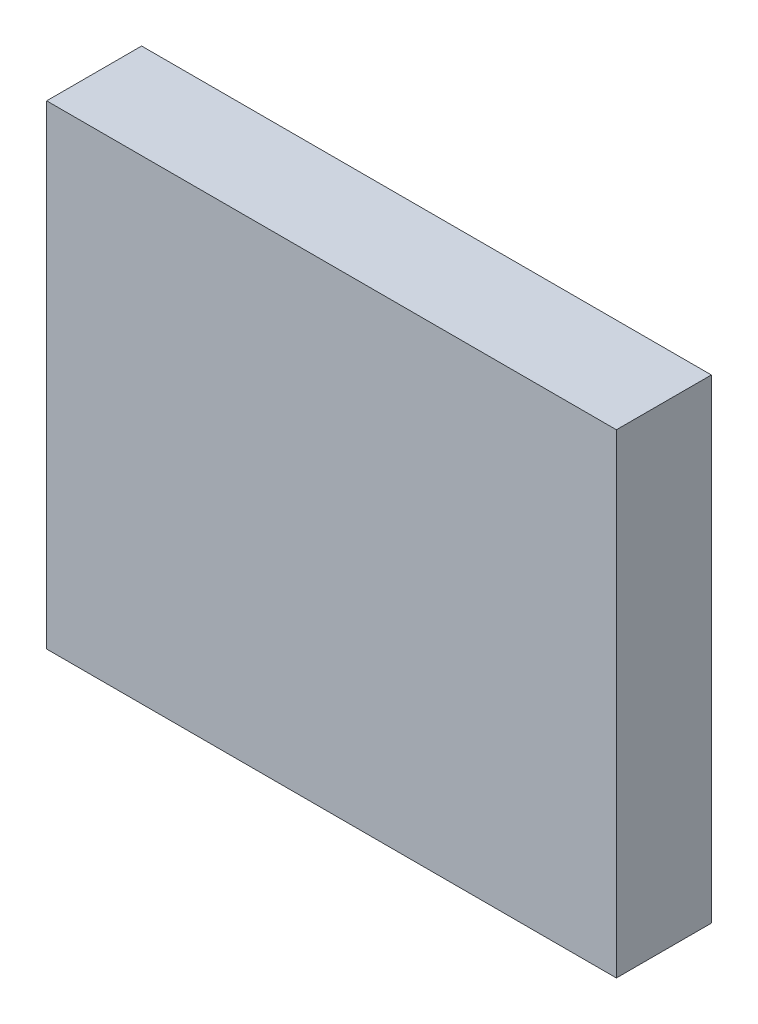
ISO-10303-21;
HEADER;
FILE_DESCRIPTION(('STEP AP214'),'2;1');
FILE_NAME('part.step','',(''),(''),'','','');
FILE_SCHEMA(('AUTOMOTIVE_DESIGN { 1 0 10303 214 1 1 1 1 }'));
ENDSEC;
DATA;
#1=APPLICATION_CONTEXT('core data for automotive mechanical design processes');
#2=APPLICATION_PROTOCOL_DEFINITION('international standard','automotive_design',2000,#1);
#3=PRODUCT_CONTEXT('',#1,'mechanical');
#4=PRODUCT('Part','Part','',(#3));
#5=PRODUCT_RELATED_PRODUCT_CATEGORY('part','',(#4));
#6=PRODUCT_DEFINITION_FORMATION('','',#4);
#7=PRODUCT_DEFINITION_CONTEXT('part definition',#1,'design');
#8=PRODUCT_DEFINITION('design','',#6,#7);
#9=PRODUCT_DEFINITION_SHAPE('','',#8);
#10=(LENGTH_UNIT() NAMED_UNIT(*) SI_UNIT(.MILLI.,.METRE.));
#11=(NAMED_UNIT(*) PLANE_ANGLE_UNIT() SI_UNIT($,.RADIAN.));
#12=(NAMED_UNIT(*) SI_UNIT($,.STERADIAN.) SOLID_ANGLE_UNIT());
#13=UNCERTAINTY_MEASURE_WITH_UNIT(LENGTH_MEASURE(1.E-05),#10,'distance_accuracy_value','');
#14=(GEOMETRIC_REPRESENTATION_CONTEXT(3) GLOBAL_UNCERTAINTY_ASSIGNED_CONTEXT((#13)) GLOBAL_UNIT_ASSIGNED_CONTEXT((#10,
#11,#12)) REPRESENTATION_CONTEXT('',''));
#15=CARTESIAN_POINT('',(0.,0.,0.));
#16=DIRECTION('',(0.,0.,1.));
#17=DIRECTION('',(1.,0.,0.));
#18=AXIS2_PLACEMENT_3D('',#15,#16,#17);
#19=CARTESIAN_POINT('',(0.,0.,0.));
#20=DIRECTION('',(0.,0.,1.));
#21=DIRECTION('',(1.,0.,0.));
#22=AXIS2_PLACEMENT_3D('',#19,#20,#21);
#23=PLANE('',#22);
#24=DIRECTION('',(0.,-1.,0.));
#25=VECTOR('',#24,1.);
#26=CARTESIAN_POINT('',(-60.,50.,0.));
#27=LINE('',#26,#25);
#28=CARTESIAN_POINT('',(-60.,50.,0.));
#29=VERTEX_POINT('',#28);
#30=CARTESIAN_POINT('',(-60.,-50.,0.));
#31=VERTEX_POINT('',#30);
#32=EDGE_CURVE('E153',#29,#31,#27,.T.);
#33=ORIENTED_EDGE('',*,*,#32,.F.);
#34=DIRECTION('',(1.,0.,0.));
#35=VECTOR('',#34,1.);
#36=CARTESIAN_POINT('',(-60.,50.,0.));
#37=LINE('',#36,#35);
#38=CARTESIAN_POINT('',(60.,50.,0.));
#39=VERTEX_POINT('',#38);
#40=EDGE_CURVE('E146',#29,#39,#37,.T.);
#41=ORIENTED_EDGE('',*,*,#40,.T.);
#42=DIRECTION('',(0.,-1.,0.));
#43=VECTOR('',#42,1.);
#44=CARTESIAN_POINT('',(60.,50.,0.));
#45=LINE('',#44,#43);
#46=CARTESIAN_POINT('',(60.,-50.,0.));
#47=VERTEX_POINT('',#46);
#48=EDGE_CURVE('E159',#39,#47,#45,.T.);
#49=ORIENTED_EDGE('',*,*,#48,.T.);
#50=DIRECTION('',(1.,0.,0.));
#51=VECTOR('',#50,1.);
#52=CARTESIAN_POINT('',(-60.,-50.,0.));
#53=LINE('',#52,#51);
#54=EDGE_CURVE('E155',#31,#47,#53,.T.);
#55=ORIENTED_EDGE('',*,*,#54,.F.);
#56=EDGE_LOOP('',(#33,#41,#49,#55));
#57=FACE_BOUND('',#56,.T.);
#58=CARTESIAN_POINT('',(-30.,-30.,0.));
#59=DIRECTION('',(0.,0.,1.));
#60=DIRECTION('',(1.,0.,0.));
#61=AXIS2_PLACEMENT_3D('',#58,#59,#60);
#62=CIRCLE('',#61,8.);
#63=CARTESIAN_POINT('',(-30.,-22.,0.));
#64=VERTEX_POINT('',#63);
#65=CARTESIAN_POINT('',(-30.,-38.,0.));
#66=VERTEX_POINT('',#65);
#67=EDGE_CURVE('E49',#64,#66,#62,.T.);
#68=ORIENTED_EDGE('',*,*,#67,.T.);
#69=DIRECTION('',(1.,0.,0.));
#70=VECTOR('',#69,1.);
#71=CARTESIAN_POINT('',(-30.,-38.,0.));
#72=LINE('',#71,#70);
#73=CARTESIAN_POINT('',(30.,-38.,0.));
#74=VERTEX_POINT('',#73);
#75=EDGE_CURVE('E130',#66,#74,#72,.T.);
#76=ORIENTED_EDGE('',*,*,#75,.T.);
#77=CARTESIAN_POINT('',(30.,-30.,0.));
#78=DIRECTION('',(0.,0.,1.));
#79=DIRECTION('',(1.,0.,0.));
#80=AXIS2_PLACEMENT_3D('',#77,#78,#79);
#81=CIRCLE('',#80,8.);
#82=CARTESIAN_POINT('',(30.,-22.,0.));
#83=VERTEX_POINT('',#82);
#84=EDGE_CURVE('E113',#74,#83,#81,.T.);
#85=ORIENTED_EDGE('',*,*,#84,.T.);
#86=DIRECTION('',(1.,0.,0.));
#87=VECTOR('',#86,1.);
#88=CARTESIAN_POINT('',(-30.,-22.,0.));
#89=LINE('',#88,#87);
#90=EDGE_CURVE('E124',#64,#83,#89,.T.);
#91=ORIENTED_EDGE('',*,*,#90,.F.);
#92=EDGE_LOOP('',(#68,#76,#85,#91));
#93=FACE_BOUND('',#92,.T.);
#94=CARTESIAN_POINT('',(0.,0.,0.));
#95=DIRECTION('',(0.,0.,1.));
#96=DIRECTION('',(1.,0.,0.));
#97=AXIS2_PLACEMENT_3D('',#94,#95,#96);
#98=CIRCLE('',#97,12.5);
#99=CARTESIAN_POINT('',(12.5,0.,0.));
#100=VERTEX_POINT('',#99);
#101=EDGE_CURVE('E136',#100,#100,#98,.T.);
#102=ORIENTED_EDGE('',*,*,#101,.T.);
#103=EDGE_LOOP('',(#102));
#104=FACE_BOUND('',#103,.T.);
#105=ADVANCED_FACE('F34',(#57,#93,#104),#23,.F.);
#106=CARTESIAN_POINT('',(-60.,50.,20.));
#107=DIRECTION('',(1.,0.,0.));
#108=DIRECTION('',(0.,1.,0.));
#109=AXIS2_PLACEMENT_3D('',#106,#107,#108);
#110=PLANE('',#109);
#111=ORIENTED_EDGE('',*,*,#32,.T.);
#112=DIRECTION('',(0.,0.,-1.));
#113=VECTOR('',#112,1.);
#114=CARTESIAN_POINT('',(-60.,-50.,20.));
#115=LINE('',#114,#113);
#116=CARTESIAN_POINT('',(-60.,-50.,20.));
#117=VERTEX_POINT('',#116);
#118=EDGE_CURVE('E11',#117,#31,#115,.T.);
#119=ORIENTED_EDGE('',*,*,#118,.F.);
#120=DIRECTION('',(0.,-1.,0.));
#121=VECTOR('',#120,1.);
#122=CARTESIAN_POINT('',(-60.,50.,20.));
#123=LINE('',#122,#121);
#124=CARTESIAN_POINT('',(-60.,50.,20.));
#125=VERTEX_POINT('',#124);
#126=EDGE_CURVE('E144',#125,#117,#123,.T.);
#127=ORIENTED_EDGE('',*,*,#126,.F.);
#128=DIRECTION('',(0.,0.,-1.));
#129=VECTOR('',#128,1.);
#130=CARTESIAN_POINT('',(-60.,50.,20.));
#131=LINE('',#130,#129);
#132=EDGE_CURVE('E58',#125,#29,#131,.T.);
#133=ORIENTED_EDGE('',*,*,#132,.T.);
#134=EDGE_LOOP('',(#111,#119,#127,#133));
#135=FACE_BOUND('',#134,.T.);
#136=ADVANCED_FACE('F36',(#135),#110,.F.);
#137=CARTESIAN_POINT('',(-60.,-50.,20.));
#138=DIRECTION('',(0.,1.,0.));
#139=DIRECTION('',(0.,0.,1.));
#140=AXIS2_PLACEMENT_3D('',#137,#138,#139);
#141=PLANE('',#140);
#142=ORIENTED_EDGE('',*,*,#54,.T.);
#143=DIRECTION('',(0.,0.,-1.));
#144=VECTOR('',#143,1.);
#145=CARTESIAN_POINT('',(60.,-50.,20.));
#146=LINE('',#145,#144);
#147=CARTESIAN_POINT('',(60.,-50.,20.));
#148=VERTEX_POINT('',#147);
#149=EDGE_CURVE('E42',#148,#47,#146,.T.);
#150=ORIENTED_EDGE('',*,*,#149,.F.);
#151=DIRECTION('',(1.,0.,0.));
#152=VECTOR('',#151,1.);
#153=CARTESIAN_POINT('',(-60.,-50.,20.));
#154=LINE('',#153,#152);
#155=EDGE_CURVE('E84',#117,#148,#154,.T.);
#156=ORIENTED_EDGE('',*,*,#155,.F.);
#157=ORIENTED_EDGE('',*,*,#118,.T.);
#158=EDGE_LOOP('',(#142,#150,#156,#157));
#159=FACE_BOUND('',#158,.T.);
#160=ADVANCED_FACE('F170',(#159),#141,.F.);
#161=CARTESIAN_POINT('',(60.,50.,20.));
#162=DIRECTION('',(1.,0.,0.));
#163=DIRECTION('',(0.,1.,0.));
#164=AXIS2_PLACEMENT_3D('',#161,#162,#163);
#165=PLANE('',#164);
#166=ORIENTED_EDGE('',*,*,#48,.F.);
#167=DIRECTION('',(0.,0.,-1.));
#168=VECTOR('',#167,1.);
#169=CARTESIAN_POINT('',(60.,50.,20.));
#170=LINE('',#169,#168);
#171=CARTESIAN_POINT('',(60.,50.,20.));
#172=VERTEX_POINT('',#171);
#173=EDGE_CURVE('E165',#172,#39,#170,.T.);
#174=ORIENTED_EDGE('',*,*,#173,.F.);
#175=DIRECTION('',(0.,-1.,0.));
#176=VECTOR('',#175,1.);
#177=CARTESIAN_POINT('',(60.,50.,20.));
#178=LINE('',#177,#176);
#179=EDGE_CURVE('E148',#172,#148,#178,.T.);
#180=ORIENTED_EDGE('',*,*,#179,.T.);
#181=ORIENTED_EDGE('',*,*,#149,.T.);
#182=EDGE_LOOP('',(#166,#174,#180,#181));
#183=FACE_BOUND('',#182,.T.);
#184=ADVANCED_FACE('F168',(#183),#165,.T.);
#185=CARTESIAN_POINT('',(-60.,50.,20.));
#186=DIRECTION('',(0.,1.,0.));
#187=DIRECTION('',(0.,0.,1.));
#188=AXIS2_PLACEMENT_3D('',#185,#186,#187);
#189=PLANE('',#188);
#190=ORIENTED_EDGE('',*,*,#40,.F.);
#191=ORIENTED_EDGE('',*,*,#132,.F.);
#192=DIRECTION('',(1.,0.,0.));
#193=VECTOR('',#192,1.);
#194=CARTESIAN_POINT('',(-60.,50.,20.));
#195=LINE('',#194,#193);
#196=EDGE_CURVE('E151',#125,#172,#195,.T.);
#197=ORIENTED_EDGE('',*,*,#196,.T.);
#198=ORIENTED_EDGE('',*,*,#173,.T.);
#199=EDGE_LOOP('',(#190,#191,#197,#198));
#200=FACE_BOUND('',#199,.T.);
#201=ADVANCED_FACE('F173',(#200),#189,.T.);
#202=CARTESIAN_POINT('',(0.,0.,20.));
#203=DIRECTION('',(0.,0.,1.));
#204=DIRECTION('',(1.,0.,0.));
#205=AXIS2_PLACEMENT_3D('',#202,#203,#204);
#206=PLANE('',#205);
#207=ORIENTED_EDGE('',*,*,#126,.T.);
#208=ORIENTED_EDGE('',*,*,#155,.T.);
#209=ORIENTED_EDGE('',*,*,#179,.F.);
#210=ORIENTED_EDGE('',*,*,#196,.F.);
#211=EDGE_LOOP('',(#207,#208,#209,#210));
#212=FACE_BOUND('',#211,.T.);
#213=ADVANCED_FACE('F176',(#212),#206,.T.);
#214=CARTESIAN_POINT('',(-30.,-30.,10.));
#215=DIRECTION('',(0.,0.,-1.));
#216=DIRECTION('',(-1.,0.,0.));
#217=AXIS2_PLACEMENT_3D('',#214,#215,#216);
#218=CYLINDRICAL_SURFACE('',#217,8.);
#219=ORIENTED_EDGE('',*,*,#67,.F.);
#220=DIRECTION('',(0.,0.,-1.));
#221=VECTOR('',#220,1.);
#222=CARTESIAN_POINT('',(-30.,-22.,10.));
#223=LINE('',#222,#221);
#224=CARTESIAN_POINT('',(-30.,-22.,10.));
#225=VERTEX_POINT('',#224);
#226=EDGE_CURVE('E120',#225,#64,#223,.T.);
#227=ORIENTED_EDGE('',*,*,#226,.F.);
#228=CARTESIAN_POINT('',(-30.,-30.,10.));
#229=DIRECTION('',(0.,0.,1.));
#230=DIRECTION('',(1.,0.,0.));
#231=AXIS2_PLACEMENT_3D('',#228,#229,#230);
#232=CIRCLE('',#231,8.);
#233=CARTESIAN_POINT('',(-30.,-38.,10.));
#234=VERTEX_POINT('',#233);
#235=EDGE_CURVE('E127',#225,#234,#232,.T.);
#236=ORIENTED_EDGE('',*,*,#235,.T.);
#237=DIRECTION('',(0.,0.,-1.));
#238=VECTOR('',#237,1.);
#239=CARTESIAN_POINT('',(-30.,-38.,10.));
#240=LINE('',#239,#238);
#241=EDGE_CURVE('E294',#234,#66,#240,.T.);
#242=ORIENTED_EDGE('',*,*,#241,.T.);
#243=EDGE_LOOP('',(#219,#227,#236,#242));
#244=FACE_BOUND('',#243,.T.);
#245=ADVANCED_FACE('F205',(#244),#218,.F.);
#246=CARTESIAN_POINT('',(-30.,-38.,10.));
#247=DIRECTION('',(0.,1.,0.));
#248=DIRECTION('',(-1.,0.,0.));
#249=AXIS2_PLACEMENT_3D('',#246,#247,#248);
#250=PLANE('',#249);
#251=ORIENTED_EDGE('',*,*,#75,.F.);
#252=ORIENTED_EDGE('',*,*,#241,.F.);
#253=DIRECTION('',(1.,0.,0.));
#254=VECTOR('',#253,1.);
#255=CARTESIAN_POINT('',(-30.,-38.,10.));
#256=LINE('',#255,#254);
#257=CARTESIAN_POINT('',(30.,-38.,10.));
#258=VERTEX_POINT('',#257);
#259=EDGE_CURVE('E140',#234,#258,#256,.T.);
#260=ORIENTED_EDGE('',*,*,#259,.T.);
#261=DIRECTION('',(0.,0.,-1.));
#262=VECTOR('',#261,1.);
#263=CARTESIAN_POINT('',(30.,-38.,10.));
#264=LINE('',#263,#262);
#265=EDGE_CURVE('E121',#258,#74,#264,.T.);
#266=ORIENTED_EDGE('',*,*,#265,.T.);
#267=EDGE_LOOP('',(#251,#252,#260,#266));
#268=FACE_BOUND('',#267,.T.);
#269=ADVANCED_FACE('F211',(#268),#250,.T.);
#270=CARTESIAN_POINT('',(30.,-30.,10.));
#271=DIRECTION('',(0.,0.,-1.));
#272=DIRECTION('',(-1.,0.,0.));
#273=AXIS2_PLACEMENT_3D('',#270,#271,#272);
#274=CYLINDRICAL_SURFACE('',#273,8.);
#275=ORIENTED_EDGE('',*,*,#84,.F.);
#276=ORIENTED_EDGE('',*,*,#265,.F.);
#277=CARTESIAN_POINT('',(30.,-30.,10.));
#278=DIRECTION('',(0.,0.,1.));
#279=DIRECTION('',(1.,0.,0.));
#280=AXIS2_PLACEMENT_3D('',#277,#278,#279);
#281=CIRCLE('',#280,8.);
#282=CARTESIAN_POINT('',(30.,-22.,10.));
#283=VERTEX_POINT('',#282);
#284=EDGE_CURVE('E116',#258,#283,#281,.T.);
#285=ORIENTED_EDGE('',*,*,#284,.T.);
#286=DIRECTION('',(0.,0.,-1.));
#287=VECTOR('',#286,1.);
#288=CARTESIAN_POINT('',(30.,-22.,10.));
#289=LINE('',#288,#287);
#290=EDGE_CURVE('E108',#283,#83,#289,.T.);
#291=ORIENTED_EDGE('',*,*,#290,.T.);
#292=EDGE_LOOP('',(#275,#276,#285,#291));
#293=FACE_BOUND('',#292,.T.);
#294=ADVANCED_FACE('F110',(#293),#274,.F.);
#295=CARTESIAN_POINT('',(-30.,-22.,10.));
#296=DIRECTION('',(0.,1.,0.));
#297=DIRECTION('',(-1.,0.,0.));
#298=AXIS2_PLACEMENT_3D('',#295,#296,#297);
#299=PLANE('',#298);
#300=ORIENTED_EDGE('',*,*,#90,.T.);
#301=ORIENTED_EDGE('',*,*,#290,.F.);
#302=DIRECTION('',(1.,0.,0.));
#303=VECTOR('',#302,1.);
#304=CARTESIAN_POINT('',(-30.,-22.,10.));
#305=LINE('',#304,#303);
#306=EDGE_CURVE('E137',#225,#283,#305,.T.);
#307=ORIENTED_EDGE('',*,*,#306,.F.);
#308=ORIENTED_EDGE('',*,*,#226,.T.);
#309=EDGE_LOOP('',(#300,#301,#307,#308));
#310=FACE_BOUND('',#309,.T.);
#311=ADVANCED_FACE('F125',(#310),#299,.F.);
#312=CARTESIAN_POINT('',(-30.,-30.,10.));
#313=DIRECTION('',(0.,0.,1.));
#314=DIRECTION('',(1.,0.,0.));
#315=AXIS2_PLACEMENT_3D('',#312,#313,#314);
#316=PLANE('',#315);
#317=ORIENTED_EDGE('',*,*,#235,.F.);
#318=ORIENTED_EDGE('',*,*,#306,.T.);
#319=ORIENTED_EDGE('',*,*,#284,.F.);
#320=ORIENTED_EDGE('',*,*,#259,.F.);
#321=EDGE_LOOP('',(#317,#318,#319,#320));
#322=FACE_BOUND('',#321,.T.);
#323=ADVANCED_FACE('F231',(#322),#316,.F.);
#324=CARTESIAN_POINT('',(0.,0.,10.));
#325=DIRECTION('',(0.,0.,-1.));
#326=DIRECTION('',(-1.,0.,0.));
#327=AXIS2_PLACEMENT_3D('',#324,#325,#326);
#328=CYLINDRICAL_SURFACE('',#327,12.5);
#329=CARTESIAN_POINT('',(0.,0.,10.));
#330=DIRECTION('',(0.,0.,1.));
#331=DIRECTION('',(1.,0.,0.));
#332=AXIS2_PLACEMENT_3D('',#329,#330,#331);
#333=CIRCLE('',#332,12.5);
#334=CARTESIAN_POINT('',(12.5,0.,10.));
#335=VERTEX_POINT('',#334);
#336=EDGE_CURVE('E156',#335,#335,#333,.T.);
#337=ORIENTED_EDGE('',*,*,#336,.T.);
#338=EDGE_LOOP('',(#337));
#339=FACE_BOUND('',#338,.T.);
#340=ORIENTED_EDGE('',*,*,#101,.F.);
#341=EDGE_LOOP('',(#340));
#342=FACE_BOUND('',#341,.T.);
#343=ADVANCED_FACE('F238',(#339,#342),#328,.F.);
#344=CARTESIAN_POINT('',(0.,0.,10.));
#345=DIRECTION('',(0.,0.,1.));
#346=DIRECTION('',(1.,0.,0.));
#347=AXIS2_PLACEMENT_3D('',#344,#345,#346);
#348=PLANE('',#347);
#349=ORIENTED_EDGE('',*,*,#336,.F.);
#350=EDGE_LOOP('',(#349));
#351=FACE_BOUND('',#350,.T.);
#352=ADVANCED_FACE('F245',(#351),#348,.F.);
#353=CLOSED_SHELL('',(#105,#136,#160,#184,#201,#213,#245,#269,#294,#311,#323,#343,#352));
#354=MANIFOLD_SOLID_BREP('B2',#353);
#355=ADVANCED_BREP_SHAPE_REPRESENTATION('',(#18,#354),#14);
#356=SHAPE_DEFINITION_REPRESENTATION(#9,#355);
ENDSEC;
END-ISO-10303-21;
